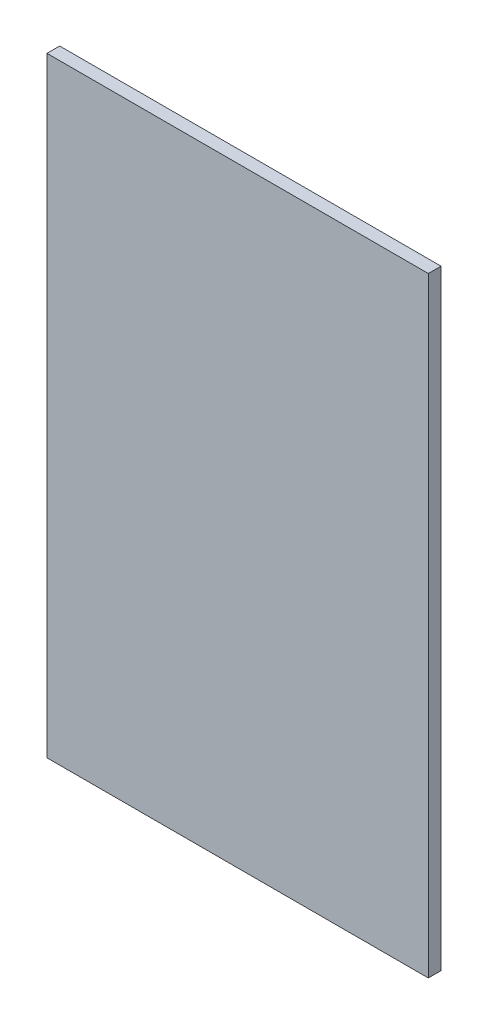
ISO-10303-21;
HEADER;
FILE_DESCRIPTION(('STEP AP214'),'2;1');
FILE_NAME('part.step','',(''),(''),'','','');
FILE_SCHEMA(('AUTOMOTIVE_DESIGN { 1 0 10303 214 1 1 1 1 }'));
ENDSEC;
DATA;
#1=APPLICATION_CONTEXT('core data for automotive mechanical design processes');
#2=APPLICATION_PROTOCOL_DEFINITION('international standard','automotive_design',2000,#1);
#3=PRODUCT_CONTEXT('',#1,'mechanical');
#4=PRODUCT('Part','Part','',(#3));
#5=PRODUCT_RELATED_PRODUCT_CATEGORY('part','',(#4));
#6=PRODUCT_DEFINITION_FORMATION('','',#4);
#7=PRODUCT_DEFINITION_CONTEXT('part definition',#1,'design');
#8=PRODUCT_DEFINITION('design','',#6,#7);
#9=PRODUCT_DEFINITION_SHAPE('','',#8);
#10=(LENGTH_UNIT() NAMED_UNIT(*) SI_UNIT(.MILLI.,.METRE.));
#11=(NAMED_UNIT(*) PLANE_ANGLE_UNIT() SI_UNIT($,.RADIAN.));
#12=(NAMED_UNIT(*) SI_UNIT($,.STERADIAN.) SOLID_ANGLE_UNIT());
#13=UNCERTAINTY_MEASURE_WITH_UNIT(LENGTH_MEASURE(1.E-05),#10,'distance_accuracy_value','');
#14=(GEOMETRIC_REPRESENTATION_CONTEXT(3) GLOBAL_UNCERTAINTY_ASSIGNED_CONTEXT((#13)) GLOBAL_UNIT_ASSIGNED_CONTEXT((#10,
#11,#12)) REPRESENTATION_CONTEXT('',''));
#15=CARTESIAN_POINT('',(0.,0.,0.));
#16=DIRECTION('',(0.,0.,1.));
#17=DIRECTION('',(1.,0.,0.));
#18=AXIS2_PLACEMENT_3D('',#15,#16,#17);
#19=CARTESIAN_POINT('',(-105.,120.,5.));
#20=DIRECTION('',(0.,-1.,0.));
#21=DIRECTION('',(0.,0.,-1.));
#22=AXIS2_PLACEMENT_3D('',#19,#20,#21);
#23=PLANE('',#22);
#24=DIRECTION('',(-1.,0.,0.));
#25=VECTOR('',#24,1.);
#26=CARTESIAN_POINT('',(-105.,120.,5.));
#27=LINE('',#26,#25);
#28=CARTESIAN_POINT('',(45.0000000000001,120.,5.));
#29=VERTEX_POINT('',#28);
#30=CARTESIAN_POINT('',(-105.,120.,5.));
#31=VERTEX_POINT('',#30);
#32=EDGE_CURVE('E85',#29,#31,#27,.T.);
#33=ORIENTED_EDGE('',*,*,#32,.F.);
#34=DIRECTION('',(0.,0.,1.));
#35=VECTOR('',#34,1.);
#36=CARTESIAN_POINT('',(45.0000000000001,120.,0.));
#37=LINE('',#36,#35);
#38=CARTESIAN_POINT('',(45.0000000000001,120.,0.));
#39=VERTEX_POINT('',#38);
#40=EDGE_CURVE('E90',#39,#29,#37,.T.);
#41=ORIENTED_EDGE('',*,*,#40,.F.);
#42=DIRECTION('',(-1.,0.,0.));
#43=VECTOR('',#42,1.);
#44=CARTESIAN_POINT('',(-105.,120.,0.));
#45=LINE('',#44,#43);
#46=CARTESIAN_POINT('',(-105.,120.,0.));
#47=VERTEX_POINT('',#46);
#48=EDGE_CURVE('E77',#39,#47,#45,.T.);
#49=ORIENTED_EDGE('',*,*,#48,.T.);
#50=DIRECTION('',(0.,0.,-1.));
#51=VECTOR('',#50,1.);
#52=CARTESIAN_POINT('',(-105.,120.,5.));
#53=LINE('',#52,#51);
#54=EDGE_CURVE('E11',#31,#47,#53,.T.);
#55=ORIENTED_EDGE('',*,*,#54,.F.);
#56=EDGE_LOOP('',(#33,#41,#49,#55));
#57=FACE_BOUND('',#56,.T.);
#58=ADVANCED_FACE('F33',(#57),#23,.F.);
#59=CARTESIAN_POINT('',(-105.,-120.,5.));
#60=DIRECTION('',(1.,0.,0.));
#61=DIRECTION('',(0.,0.,-1.));
#62=AXIS2_PLACEMENT_3D('',#59,#60,#61);
#63=PLANE('',#62);
#64=DIRECTION('',(0.,-1.,0.));
#65=VECTOR('',#64,1.);
#66=CARTESIAN_POINT('',(-105.,-120.,0.));
#67=LINE('',#66,#65);
#68=CARTESIAN_POINT('',(-105.,-120.,0.));
#69=VERTEX_POINT('',#68);
#70=EDGE_CURVE('E68',#47,#69,#67,.T.);
#71=ORIENTED_EDGE('',*,*,#70,.T.);
#72=DIRECTION('',(0.,0.,-1.));
#73=VECTOR('',#72,1.);
#74=CARTESIAN_POINT('',(-105.,-120.,5.));
#75=LINE('',#74,#73);
#76=CARTESIAN_POINT('',(-105.,-120.,5.));
#77=VERTEX_POINT('',#76);
#78=EDGE_CURVE('E40',#77,#69,#75,.T.);
#79=ORIENTED_EDGE('',*,*,#78,.F.);
#80=DIRECTION('',(0.,-1.,0.));
#81=VECTOR('',#80,1.);
#82=CARTESIAN_POINT('',(-105.,-120.,5.));
#83=LINE('',#82,#81);
#84=EDGE_CURVE('E56',#31,#77,#83,.T.);
#85=ORIENTED_EDGE('',*,*,#84,.F.);
#86=ORIENTED_EDGE('',*,*,#54,.T.);
#87=EDGE_LOOP('',(#71,#79,#85,#86));
#88=FACE_BOUND('',#87,.T.);
#89=ADVANCED_FACE('F70',(#88),#63,.F.);
#90=CARTESIAN_POINT('',(-105.,-120.,5.));
#91=DIRECTION('',(0.,1.,0.));
#92=DIRECTION('',(0.,0.,1.));
#93=AXIS2_PLACEMENT_3D('',#90,#91,#92);
#94=PLANE('',#93);
#95=DIRECTION('',(1.,0.,0.));
#96=VECTOR('',#95,1.);
#97=CARTESIAN_POINT('',(-105.,-120.,0.));
#98=LINE('',#97,#96);
#99=CARTESIAN_POINT('',(45.0000000000001,-120.,0.));
#100=VERTEX_POINT('',#99);
#101=EDGE_CURVE('E76',#69,#100,#98,.T.);
#102=ORIENTED_EDGE('',*,*,#101,.T.);
#103=DIRECTION('',(0.,0.,1.));
#104=VECTOR('',#103,1.);
#105=CARTESIAN_POINT('',(45.0000000000001,-120.,0.));
#106=LINE('',#105,#104);
#107=CARTESIAN_POINT('',(45.0000000000001,-120.,5.));
#108=VERTEX_POINT('',#107);
#109=EDGE_CURVE('E47',#100,#108,#106,.T.);
#110=ORIENTED_EDGE('',*,*,#109,.T.);
#111=DIRECTION('',(1.,0.,0.));
#112=VECTOR('',#111,1.);
#113=CARTESIAN_POINT('',(-105.,-120.,5.));
#114=LINE('',#113,#112);
#115=EDGE_CURVE('E82',#77,#108,#114,.T.);
#116=ORIENTED_EDGE('',*,*,#115,.F.);
#117=ORIENTED_EDGE('',*,*,#78,.T.);
#118=EDGE_LOOP('',(#102,#110,#116,#117));
#119=FACE_BOUND('',#118,.T.);
#120=ADVANCED_FACE('F81',(#119),#94,.F.);
#121=CARTESIAN_POINT('',(0.,0.,5.));
#122=DIRECTION('',(0.,0.,-1.));
#123=DIRECTION('',(-1.,0.,0.));
#124=AXIS2_PLACEMENT_3D('',#121,#122,#123);
#125=PLANE('',#124);
#126=ORIENTED_EDGE('',*,*,#115,.T.);
#127=DIRECTION('',(0.,-1.,0.));
#128=VECTOR('',#127,1.);
#129=CARTESIAN_POINT('',(45.0000000000001,-120.,5.));
#130=LINE('',#129,#128);
#131=EDGE_CURVE('E96',#29,#108,#130,.T.);
#132=ORIENTED_EDGE('',*,*,#131,.F.);
#133=ORIENTED_EDGE('',*,*,#32,.T.);
#134=ORIENTED_EDGE('',*,*,#84,.T.);
#135=EDGE_LOOP('',(#126,#132,#133,#134));
#136=FACE_BOUND('',#135,.T.);
#137=ADVANCED_FACE('F105',(#136),#125,.F.);
#138=CARTESIAN_POINT('',(0.,0.,0.));
#139=DIRECTION('',(0.,0.,-1.));
#140=DIRECTION('',(-1.,0.,0.));
#141=AXIS2_PLACEMENT_3D('',#138,#139,#140);
#142=PLANE('',#141);
#143=DIRECTION('',(0.,-1.,0.));
#144=VECTOR('',#143,1.);
#145=CARTESIAN_POINT('',(45.0000000000001,-120.,0.));
#146=LINE('',#145,#144);
#147=EDGE_CURVE('E84',#39,#100,#146,.T.);
#148=ORIENTED_EDGE('',*,*,#147,.T.);
#149=ORIENTED_EDGE('',*,*,#101,.F.);
#150=ORIENTED_EDGE('',*,*,#70,.F.);
#151=ORIENTED_EDGE('',*,*,#48,.F.);
#152=EDGE_LOOP('',(#148,#149,#150,#151));
#153=FACE_BOUND('',#152,.T.);
#154=ADVANCED_FACE('F83',(#153),#142,.T.);
#155=CARTESIAN_POINT('',(45.0000000000001,-120.,0.));
#156=DIRECTION('',(-1.,0.,0.));
#157=DIRECTION('',(0.,-1.,0.));
#158=AXIS2_PLACEMENT_3D('',#155,#156,#157);
#159=PLANE('',#158);
#160=ORIENTED_EDGE('',*,*,#131,.T.);
#161=ORIENTED_EDGE('',*,*,#109,.F.);
#162=ORIENTED_EDGE('',*,*,#147,.F.);
#163=ORIENTED_EDGE('',*,*,#40,.T.);
#164=EDGE_LOOP('',(#160,#161,#162,#163));
#165=FACE_BOUND('',#164,.T.);
#166=ADVANCED_FACE('F100',(#165),#159,.F.);
#167=CLOSED_SHELL('',(#58,#89,#120,#137,#154,#166));
#168=MANIFOLD_SOLID_BREP('B2',#167);
#169=ADVANCED_BREP_SHAPE_REPRESENTATION('',(#18,#168),#14);
#170=SHAPE_DEFINITION_REPRESENTATION(#9,#169);
ENDSEC;
END-ISO-10303-21;
